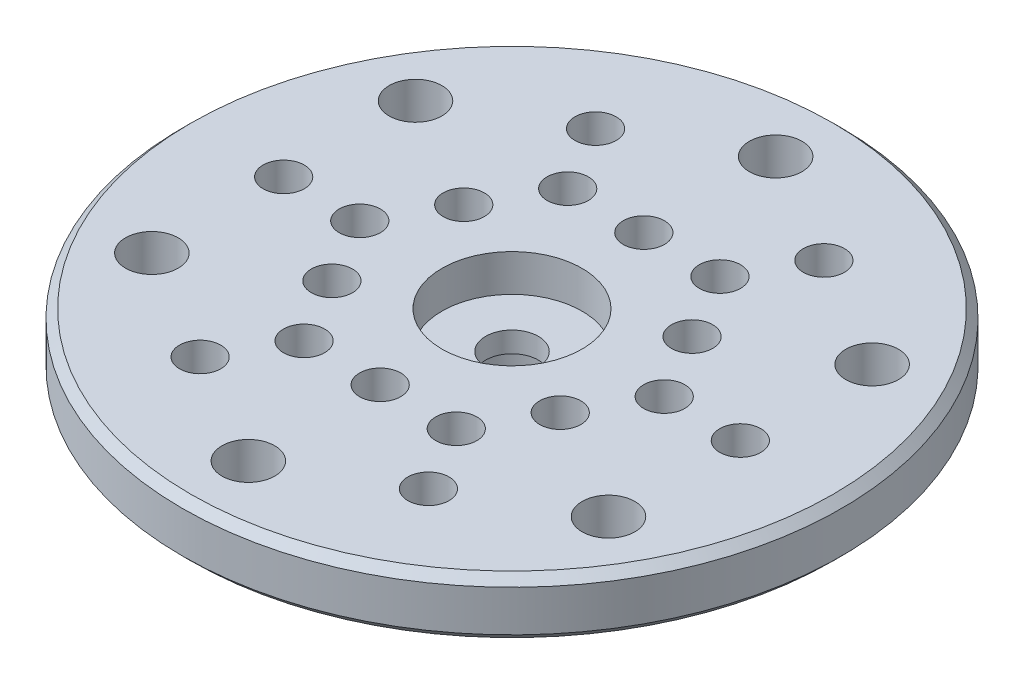
ISO-10303-21;
HEADER;
FILE_DESCRIPTION(('STEP AP214'),'2;1');
FILE_NAME('part.step','',(''),(''),'','','');
FILE_SCHEMA(('AUTOMOTIVE_DESIGN { 1 0 10303 214 1 1 1 1 }'));
ENDSEC;
DATA;
#1=APPLICATION_CONTEXT('core data for automotive mechanical design processes');
#2=APPLICATION_PROTOCOL_DEFINITION('international standard','automotive_design',2000,#1);
#3=PRODUCT_CONTEXT('',#1,'mechanical');
#4=PRODUCT('Part','Part','',(#3));
#5=PRODUCT_RELATED_PRODUCT_CATEGORY('part','',(#4));
#6=PRODUCT_DEFINITION_FORMATION('','',#4);
#7=PRODUCT_DEFINITION_CONTEXT('part definition',#1,'design');
#8=PRODUCT_DEFINITION('design','',#6,#7);
#9=PRODUCT_DEFINITION_SHAPE('','',#8);
#10=(LENGTH_UNIT() NAMED_UNIT(*) SI_UNIT(.MILLI.,.METRE.));
#11=(NAMED_UNIT(*) PLANE_ANGLE_UNIT() SI_UNIT($,.RADIAN.));
#12=(NAMED_UNIT(*) SI_UNIT($,.STERADIAN.) SOLID_ANGLE_UNIT());
#13=UNCERTAINTY_MEASURE_WITH_UNIT(LENGTH_MEASURE(1.E-05),#10,'distance_accuracy_value','');
#14=(GEOMETRIC_REPRESENTATION_CONTEXT(3) GLOBAL_UNCERTAINTY_ASSIGNED_CONTEXT((#13)) GLOBAL_UNIT_ASSIGNED_CONTEXT((#10,
#11,#12)) REPRESENTATION_CONTEXT('',''));
#15=CARTESIAN_POINT('',(0.,0.,0.));
#16=DIRECTION('',(0.,0.,1.));
#17=DIRECTION('',(1.,0.,0.));
#18=AXIS2_PLACEMENT_3D('',#15,#16,#17);
#19=CARTESIAN_POINT('',(0.,1.25,0.));
#20=DIRECTION('',(0.,1.,0.));
#21=DIRECTION('',(1.,0.,0.));
#22=AXIS2_PLACEMENT_3D('',#19,#20,#21);
#23=PLANE('',#22);
#24=CARTESIAN_POINT('',(0.,1.25,0.));
#25=DIRECTION('',(0.,1.,0.));
#26=DIRECTION('',(0.,0.,1.));
#27=AXIS2_PLACEMENT_3D('',#24,#25,#26);
#28=CIRCLE('',#27,1.6);
#29=CARTESIAN_POINT('',(0.,1.25,1.6));
#30=VERTEX_POINT('',#29);
#31=EDGE_CURVE('E62',#30,#30,#28,.T.);
#32=ORIENTED_EDGE('',*,*,#31,.F.);
#33=EDGE_LOOP('',(#32));
#34=FACE_BOUND('',#33,.T.);
#35=CARTESIAN_POINT('',(0.,1.25,0.));
#36=DIRECTION('',(0.,1.,0.));
#37=DIRECTION('',(0.,0.,1.));
#38=AXIS2_PLACEMENT_3D('',#35,#36,#37);
#39=CIRCLE('',#38,4.25);
#40=CARTESIAN_POINT('',(0.,1.25,4.25));
#41=VERTEX_POINT('',#40);
#42=EDGE_CURVE('E17',#41,#41,#39,.T.);
#43=ORIENTED_EDGE('',*,*,#42,.T.);
#44=EDGE_LOOP('',(#43));
#45=FACE_BOUND('',#44,.T.);
#46=ADVANCED_FACE('F14',(#34,#45),#23,.T.);
#47=CARTESIAN_POINT('',(0.,0.,0.));
#48=DIRECTION('',(0.,1.,0.));
#49=DIRECTION('',(1.,0.,0.));
#50=AXIS2_PLACEMENT_3D('',#47,#48,#49);
#51=PLANE('',#50);
#52=CARTESIAN_POINT('',(0.,0.,0.));
#53=DIRECTION('',(0.,1.,0.));
#54=DIRECTION('',(0.,0.,1.));
#55=AXIS2_PLACEMENT_3D('',#52,#53,#54);
#56=CIRCLE('',#55,1.6);
#57=CARTESIAN_POINT('',(0.,0.,1.6));
#58=VERTEX_POINT('',#57);
#59=EDGE_CURVE('E61',#58,#58,#56,.T.);
#60=ORIENTED_EDGE('',*,*,#59,.T.);
#61=EDGE_LOOP('',(#60));
#62=FACE_BOUND('',#61,.T.);
#63=CARTESIAN_POINT('',(0.,0.,0.));
#64=DIRECTION('',(0.,-1.,0.));
#65=DIRECTION('',(0.,0.,-1.));
#66=AXIS2_PLACEMENT_3D('',#63,#64,#65);
#67=CIRCLE('',#66,3.);
#68=CARTESIAN_POINT('',(0.,0.,-3.));
#69=VERTEX_POINT('',#68);
#70=EDGE_CURVE('E9',#69,#69,#67,.T.);
#71=ORIENTED_EDGE('',*,*,#70,.T.);
#72=EDGE_LOOP('',(#71));
#73=FACE_BOUND('',#72,.T.);
#74=ADVANCED_FACE('F365',(#62,#73),#51,.F.);
#75=CARTESIAN_POINT('',(0.,-3.5,0.));
#76=DIRECTION('',(0.,-1.,0.));
#77=DIRECTION('',(0.,0.,-1.));
#78=AXIS2_PLACEMENT_3D('',#75,#76,#77);
#79=PLANE('',#78);
#80=CARTESIAN_POINT('',(0.,-3.5,0.));
#81=DIRECTION('',(0.,1.,0.));
#82=DIRECTION('',(0.,0.,-1.));
#83=AXIS2_PLACEMENT_3D('',#80,#81,#82);
#84=CIRCLE('',#83,3.5);
#85=CARTESIAN_POINT('',(0.,-3.5,-3.5));
#86=VERTEX_POINT('',#85);
#87=EDGE_CURVE('E60',#86,#86,#84,.T.);
#88=ORIENTED_EDGE('',*,*,#87,.T.);
#89=EDGE_LOOP('',(#88));
#90=FACE_BOUND('',#89,.T.);
#91=CARTESIAN_POINT('',(0.,-3.5,0.));
#92=DIRECTION('',(0.,-1.,0.));
#93=DIRECTION('',(0.,0.,-1.));
#94=AXIS2_PLACEMENT_3D('',#91,#92,#93);
#95=CIRCLE('',#94,4.);
#96=CARTESIAN_POINT('',(0.,-3.5,-4.));
#97=VERTEX_POINT('',#96);
#98=EDGE_CURVE('E51',#97,#97,#95,.T.);
#99=ORIENTED_EDGE('',*,*,#98,.T.);
#100=EDGE_LOOP('',(#99));
#101=FACE_BOUND('',#100,.T.);
#102=ADVANCED_FACE('F369',(#90,#101),#79,.T.);
#103=CARTESIAN_POINT('',(0.,0.,0.));
#104=DIRECTION('',(0.,1.,0.));
#105=DIRECTION('',(1.,0.,0.));
#106=AXIS2_PLACEMENT_3D('',#103,#104,#105);
#107=PLANE('',#106);
#108=CARTESIAN_POINT('',(0.,0.,0.));
#109=DIRECTION('',(0.,1.,0.));
#110=DIRECTION('',(0.,0.,1.));
#111=AXIS2_PLACEMENT_3D('',#108,#109,#110);
#112=CIRCLE('',#111,5.);
#113=CARTESIAN_POINT('',(0.,0.,5.));
#114=VERTEX_POINT('',#113);
#115=EDGE_CURVE('E45',#114,#114,#112,.T.);
#116=ORIENTED_EDGE('',*,*,#115,.T.);
#117=EDGE_LOOP('',(#116));
#118=FACE_BOUND('',#117,.T.);
#119=CARTESIAN_POINT('',(-6.92820323027551,0.,-12.));
#120=DIRECTION('',(0.,1.,0.));
#121=DIRECTION('',(0.,0.,1.));
#122=AXIS2_PLACEMENT_3D('',#119,#120,#121);
#123=CIRCLE('',#122,1.25);
#124=CARTESIAN_POINT('',(-6.92820323027551,0.,-10.75));
#125=VERTEX_POINT('',#124);
#126=EDGE_CURVE('E34',#125,#125,#123,.T.);
#127=ORIENTED_EDGE('',*,*,#126,.T.);
#128=EDGE_LOOP('',(#127));
#129=FACE_BOUND('',#128,.T.);
#130=CARTESIAN_POINT('',(6.92820323027551,0.,-12.));
#131=DIRECTION('',(0.,1.,0.));
#132=DIRECTION('',(0.,0.,1.));
#133=AXIS2_PLACEMENT_3D('',#130,#131,#132);
#134=CIRCLE('',#133,1.25);
#135=CARTESIAN_POINT('',(6.92820323027551,0.,-10.75));
#136=VERTEX_POINT('',#135);
#137=EDGE_CURVE('E82',#136,#136,#134,.T.);
#138=ORIENTED_EDGE('',*,*,#137,.T.);
#139=EDGE_LOOP('',(#138));
#140=FACE_BOUND('',#139,.T.);
#141=CARTESIAN_POINT('',(13.856406460551,0.,1.30126035842245E-13));
#142=DIRECTION('',(0.,1.,0.));
#143=DIRECTION('',(0.,0.,1.));
#144=AXIS2_PLACEMENT_3D('',#141,#142,#143);
#145=CIRCLE('',#144,1.25);
#146=CARTESIAN_POINT('',(13.856406460551,0.,1.25000000000013));
#147=VERTEX_POINT('',#146);
#148=EDGE_CURVE('E94',#147,#147,#145,.T.);
#149=ORIENTED_EDGE('',*,*,#148,.T.);
#150=EDGE_LOOP('',(#149));
#151=FACE_BOUND('',#150,.T.);
#152=CARTESIAN_POINT('',(6.9282032302754,0.,12.));
#153=DIRECTION('',(0.,1.,0.));
#154=DIRECTION('',(0.,0.,1.));
#155=AXIS2_PLACEMENT_3D('',#152,#153,#154);
#156=CIRCLE('',#155,1.25);
#157=CARTESIAN_POINT('',(6.9282032302754,0.,13.25));
#158=VERTEX_POINT('',#157);
#159=EDGE_CURVE('E107',#158,#158,#156,.T.);
#160=ORIENTED_EDGE('',*,*,#159,.T.);
#161=EDGE_LOOP('',(#160));
#162=FACE_BOUND('',#161,.T.);
#163=CARTESIAN_POINT('',(-6.92820323027563,0.,12.));
#164=DIRECTION('',(0.,1.,0.));
#165=DIRECTION('',(0.,0.,1.));
#166=AXIS2_PLACEMENT_3D('',#163,#164,#165);
#167=CIRCLE('',#166,1.25);
#168=CARTESIAN_POINT('',(-6.92820323027563,0.,13.25));
#169=VERTEX_POINT('',#168);
#170=EDGE_CURVE('E119',#169,#169,#167,.T.);
#171=ORIENTED_EDGE('',*,*,#170,.T.);
#172=EDGE_LOOP('',(#171));
#173=FACE_BOUND('',#172,.T.);
#174=CARTESIAN_POINT('',(-13.856406460551,0.,-1.3010426069826E-13));
#175=DIRECTION('',(0.,1.,0.));
#176=DIRECTION('',(0.,0.,1.));
#177=AXIS2_PLACEMENT_3D('',#174,#175,#176);
#178=CIRCLE('',#177,1.25);
#179=CARTESIAN_POINT('',(-13.856406460551,0.,1.24999999999987));
#180=VERTEX_POINT('',#179);
#181=EDGE_CURVE('E142',#180,#180,#178,.T.);
#182=ORIENTED_EDGE('',*,*,#181,.T.);
#183=EDGE_LOOP('',(#182));
#184=FACE_BOUND('',#183,.T.);
#185=CARTESIAN_POINT('',(-6.92820323027556,0.,3.99999999999992));
#186=DIRECTION('',(0.,1.,0.));
#187=DIRECTION('',(0.,0.,1.));
#188=AXIS2_PLACEMENT_3D('',#185,#186,#187);
#189=CIRCLE('',#188,1.25);
#190=CARTESIAN_POINT('',(-6.92820323027556,0.,5.24999999999992));
#191=VERTEX_POINT('',#190);
#192=EDGE_CURVE('E125',#191,#191,#189,.T.);
#193=ORIENTED_EDGE('',*,*,#192,.T.);
#194=EDGE_LOOP('',(#193));
#195=FACE_BOUND('',#194,.T.);
#196=CARTESIAN_POINT('',(-9.23760430703402,0.,-1.07552855510562E-13));
#197=DIRECTION('',(0.,1.,0.));
#198=DIRECTION('',(0.,0.,1.));
#199=AXIS2_PLACEMENT_3D('',#196,#197,#198);
#200=CIRCLE('',#199,1.25);
#201=CARTESIAN_POINT('',(-9.23760430703402,0.,1.24999999999989));
#202=VERTEX_POINT('',#201);
#203=EDGE_CURVE('E135',#202,#202,#200,.T.);
#204=ORIENTED_EDGE('',*,*,#203,.T.);
#205=EDGE_LOOP('',(#204));
#206=FACE_BOUND('',#205,.T.);
#207=CARTESIAN_POINT('',(-6.92820323027547,0.,-4.00000000000008));
#208=DIRECTION('',(0.,1.,0.));
#209=DIRECTION('',(0.,0.,1.));
#210=AXIS2_PLACEMENT_3D('',#207,#208,#209);
#211=CIRCLE('',#210,1.25);
#212=CARTESIAN_POINT('',(-6.92820323027547,0.,-2.75000000000008));
#213=VERTEX_POINT('',#212);
#214=EDGE_CURVE('E132',#213,#213,#211,.T.);
#215=ORIENTED_EDGE('',*,*,#214,.T.);
#216=EDGE_LOOP('',(#215));
#217=FACE_BOUND('',#216,.T.);
#218=CARTESIAN_POINT('',(-4.61880215351701,0.,-8.));
#219=DIRECTION('',(0.,1.,0.));
#220=DIRECTION('',(0.,0.,1.));
#221=AXIS2_PLACEMENT_3D('',#218,#219,#220);
#222=CIRCLE('',#221,1.25);
#223=CARTESIAN_POINT('',(-4.61880215351701,0.,-6.75));
#224=VERTEX_POINT('',#223);
#225=EDGE_CURVE('E143',#224,#224,#222,.T.);
#226=ORIENTED_EDGE('',*,*,#225,.T.);
#227=EDGE_LOOP('',(#226));
#228=FACE_BOUND('',#227,.T.);
#229=CARTESIAN_POINT('',(0.,0.,-8.));
#230=DIRECTION('',(0.,1.,0.));
#231=DIRECTION('',(0.,0.,1.));
#232=AXIS2_PLACEMENT_3D('',#229,#230,#231);
#233=CIRCLE('',#232,1.25);
#234=CARTESIAN_POINT('',(0.,0.,-6.75));
#235=VERTEX_POINT('',#234);
#236=EDGE_CURVE('E161',#235,#235,#233,.T.);
#237=ORIENTED_EDGE('',*,*,#236,.T.);
#238=EDGE_LOOP('',(#237));
#239=FACE_BOUND('',#238,.T.);
#240=CARTESIAN_POINT('',(4.61880215351701,0.,-8.));
#241=DIRECTION('',(0.,1.,0.));
#242=DIRECTION('',(0.,0.,1.));
#243=AXIS2_PLACEMENT_3D('',#240,#241,#242);
#244=CIRCLE('',#243,1.25);
#245=CARTESIAN_POINT('',(4.61880215351701,0.,-6.75));
#246=VERTEX_POINT('',#245);
#247=EDGE_CURVE('E165',#246,#246,#244,.T.);
#248=ORIENTED_EDGE('',*,*,#247,.T.);
#249=EDGE_LOOP('',(#248));
#250=FACE_BOUND('',#249,.T.);
#251=CARTESIAN_POINT('',(6.92820323027552,0.,-4.));
#252=DIRECTION('',(0.,1.,0.));
#253=DIRECTION('',(0.,0.,1.));
#254=AXIS2_PLACEMENT_3D('',#251,#252,#253);
#255=CIRCLE('',#254,1.25);
#256=CARTESIAN_POINT('',(6.92820323027552,0.,-2.75));
#257=VERTEX_POINT('',#256);
#258=EDGE_CURVE('E170',#257,#257,#255,.T.);
#259=ORIENTED_EDGE('',*,*,#258,.T.);
#260=EDGE_LOOP('',(#259));
#261=FACE_BOUND('',#260,.T.);
#262=CARTESIAN_POINT('',(9.23760430703401,0.,1.07585230988181E-13));
#263=DIRECTION('',(0.,1.,0.));
#264=DIRECTION('',(0.,0.,1.));
#265=AXIS2_PLACEMENT_3D('',#262,#263,#264);
#266=CIRCLE('',#265,1.25);
#267=CARTESIAN_POINT('',(9.23760430703401,0.,1.25000000000011));
#268=VERTEX_POINT('',#267);
#269=EDGE_CURVE('E175',#268,#268,#266,.T.);
#270=ORIENTED_EDGE('',*,*,#269,.T.);
#271=EDGE_LOOP('',(#270));
#272=FACE_BOUND('',#271,.T.);
#273=CARTESIAN_POINT('',(6.9282032302755,0.,4.));
#274=DIRECTION('',(0.,1.,0.));
#275=DIRECTION('',(0.,0.,1.));
#276=AXIS2_PLACEMENT_3D('',#273,#274,#275);
#277=CIRCLE('',#276,1.25);
#278=CARTESIAN_POINT('',(6.9282032302755,0.,5.25));
#279=VERTEX_POINT('',#278);
#280=EDGE_CURVE('E188',#279,#279,#277,.T.);
#281=ORIENTED_EDGE('',*,*,#280,.T.);
#282=EDGE_LOOP('',(#281));
#283=FACE_BOUND('',#282,.T.);
#284=CARTESIAN_POINT('',(4.61880215351691,0.,8.));
#285=DIRECTION('',(0.,1.,0.));
#286=DIRECTION('',(0.,0.,1.));
#287=AXIS2_PLACEMENT_3D('',#284,#285,#286);
#288=CIRCLE('',#287,1.25);
#289=CARTESIAN_POINT('',(4.61880215351691,0.,9.25));
#290=VERTEX_POINT('',#289);
#291=EDGE_CURVE('E191',#290,#290,#288,.T.);
#292=ORIENTED_EDGE('',*,*,#291,.T.);
#293=EDGE_LOOP('',(#292));
#294=FACE_BOUND('',#293,.T.);
#295=CARTESIAN_POINT('',(0.,0.,8.));
#296=DIRECTION('',(0.,1.,0.));
#297=DIRECTION('',(0.,0.,1.));
#298=AXIS2_PLACEMENT_3D('',#295,#296,#297);
#299=CIRCLE('',#298,1.25);
#300=CARTESIAN_POINT('',(0.,0.,9.25));
#301=VERTEX_POINT('',#300);
#302=EDGE_CURVE('E205',#301,#301,#299,.T.);
#303=ORIENTED_EDGE('',*,*,#302,.T.);
#304=EDGE_LOOP('',(#303));
#305=FACE_BOUND('',#304,.T.);
#306=CARTESIAN_POINT('',(-4.61880215351711,0.,8.));
#307=DIRECTION('',(0.,1.,0.));
#308=DIRECTION('',(0.,0.,1.));
#309=AXIS2_PLACEMENT_3D('',#306,#307,#308);
#310=CIRCLE('',#309,1.25);
#311=CARTESIAN_POINT('',(-4.61880215351711,0.,9.25));
#312=VERTEX_POINT('',#311);
#313=EDGE_CURVE('E213',#312,#312,#310,.T.);
#314=ORIENTED_EDGE('',*,*,#313,.T.);
#315=EDGE_LOOP('',(#314));
#316=FACE_BOUND('',#315,.T.);
#317=CARTESIAN_POINT('',(13.856406460551,0.,8.));
#318=DIRECTION('',(0.,1.,0.));
#319=DIRECTION('',(0.,0.,1.));
#320=AXIS2_PLACEMENT_3D('',#317,#318,#319);
#321=CIRCLE('',#320,1.6);
#322=CARTESIAN_POINT('',(13.856406460551,0.,9.6));
#323=VERTEX_POINT('',#322);
#324=EDGE_CURVE('E217',#323,#323,#321,.T.);
#325=ORIENTED_EDGE('',*,*,#324,.T.);
#326=EDGE_LOOP('',(#325));
#327=FACE_BOUND('',#326,.T.);
#328=CARTESIAN_POINT('',(13.856406460551,0.,-8.));
#329=DIRECTION('',(0.,1.,0.));
#330=DIRECTION('',(0.,0.,1.));
#331=AXIS2_PLACEMENT_3D('',#328,#329,#330);
#332=CIRCLE('',#331,1.6);
#333=CARTESIAN_POINT('',(13.856406460551,0.,-6.4));
#334=VERTEX_POINT('',#333);
#335=EDGE_CURVE('E235',#334,#334,#332,.T.);
#336=ORIENTED_EDGE('',*,*,#335,.T.);
#337=EDGE_LOOP('',(#336));
#338=FACE_BOUND('',#337,.T.);
#339=CARTESIAN_POINT('',(-1.08257955891027E-13,0.,16.));
#340=DIRECTION('',(0.,1.,0.));
#341=DIRECTION('',(0.,0.,1.));
#342=AXIS2_PLACEMENT_3D('',#339,#340,#341);
#343=CIRCLE('',#342,1.6);
#344=CARTESIAN_POINT('',(-1.08257955891027E-13,0.,17.6));
#345=VERTEX_POINT('',#344);
#346=EDGE_CURVE('E242',#345,#345,#343,.T.);
#347=ORIENTED_EDGE('',*,*,#346,.T.);
#348=EDGE_LOOP('',(#347));
#349=FACE_BOUND('',#348,.T.);
#350=CARTESIAN_POINT('',(-13.8564064605511,0.,7.99999999999988));
#351=DIRECTION('',(0.,1.,0.));
#352=DIRECTION('',(0.,0.,1.));
#353=AXIS2_PLACEMENT_3D('',#350,#351,#352);
#354=CIRCLE('',#353,1.6);
#355=CARTESIAN_POINT('',(-13.8564064605511,0.,9.59999999999988));
#356=VERTEX_POINT('',#355);
#357=EDGE_CURVE('E253',#356,#356,#354,.T.);
#358=ORIENTED_EDGE('',*,*,#357,.T.);
#359=EDGE_LOOP('',(#358));
#360=FACE_BOUND('',#359,.T.);
#361=CARTESIAN_POINT('',(-13.8564064605509,0.,-8.00000000000017));
#362=DIRECTION('',(0.,1.,0.));
#363=DIRECTION('',(0.,0.,1.));
#364=AXIS2_PLACEMENT_3D('',#361,#362,#363);
#365=CIRCLE('',#364,1.6);
#366=CARTESIAN_POINT('',(-13.8564064605509,0.,-6.40000000000017));
#367=VERTEX_POINT('',#366);
#368=EDGE_CURVE('E267',#367,#367,#365,.T.);
#369=ORIENTED_EDGE('',*,*,#368,.T.);
#370=EDGE_LOOP('',(#369));
#371=FACE_BOUND('',#370,.T.);
#372=CARTESIAN_POINT('',(0.,0.,-16.));
#373=DIRECTION('',(0.,1.,0.));
#374=DIRECTION('',(0.,0.,1.));
#375=AXIS2_PLACEMENT_3D('',#372,#373,#374);
#376=CIRCLE('',#375,1.6);
#377=CARTESIAN_POINT('',(0.,0.,-14.4));
#378=VERTEX_POINT('',#377);
#379=EDGE_CURVE('E284',#378,#378,#376,.T.);
#380=ORIENTED_EDGE('',*,*,#379,.T.);
#381=EDGE_LOOP('',(#380));
#382=FACE_BOUND('',#381,.T.);
#383=CARTESIAN_POINT('',(0.,0.,0.));
#384=DIRECTION('',(0.,-1.,0.));
#385=DIRECTION('',(0.,0.,1.));
#386=AXIS2_PLACEMENT_3D('',#383,#384,#385);
#387=CIRCLE('',#386,19.5);
#388=CARTESIAN_POINT('',(0.,0.,19.5));
#389=VERTEX_POINT('',#388);
#390=EDGE_CURVE('E41',#389,#389,#387,.T.);
#391=ORIENTED_EDGE('',*,*,#390,.T.);
#392=EDGE_LOOP('',(#391));
#393=FACE_BOUND('',#392,.T.);
#394=ADVANCED_FACE('F304',(#118,#129,#140,#151,#162,#173,#184,#195,#206,#217,#228,#239,#250,
#261,#272,#283,#294,#305,#316,#327,#338,#349,#360,#371,#382,#393),#107,.F.);
#395=CARTESIAN_POINT('',(0.,3.5,0.));
#396=DIRECTION('',(0.,1.,0.));
#397=DIRECTION('',(1.,0.,0.));
#398=AXIS2_PLACEMENT_3D('',#395,#396,#397);
#399=PLANE('',#398);
#400=CARTESIAN_POINT('',(0.,3.5,0.));
#401=DIRECTION('',(0.,1.,0.));
#402=DIRECTION('',(0.,0.,1.));
#403=AXIS2_PLACEMENT_3D('',#400,#401,#402);
#404=CIRCLE('',#403,4.25);
#405=CARTESIAN_POINT('',(0.,3.5,4.25));
#406=VERTEX_POINT('',#405);
#407=EDGE_CURVE('E22',#406,#406,#404,.T.);
#408=ORIENTED_EDGE('',*,*,#407,.F.);
#409=EDGE_LOOP('',(#408));
#410=FACE_BOUND('',#409,.T.);
#411=CARTESIAN_POINT('',(-6.92820323027551,3.5,-12.));
#412=DIRECTION('',(0.,1.,0.));
#413=DIRECTION('',(0.,0.,1.));
#414=AXIS2_PLACEMENT_3D('',#411,#412,#413);
#415=CIRCLE('',#414,1.25);
#416=CARTESIAN_POINT('',(-6.92820323027551,3.5,-10.75));
#417=VERTEX_POINT('',#416);
#418=EDGE_CURVE('E254',#417,#417,#415,.T.);
#419=ORIENTED_EDGE('',*,*,#418,.F.);
#420=EDGE_LOOP('',(#419));
#421=FACE_BOUND('',#420,.T.);
#422=CARTESIAN_POINT('',(6.92820323027551,3.5,-12.));
#423=DIRECTION('',(0.,1.,0.));
#424=DIRECTION('',(0.,0.,1.));
#425=AXIS2_PLACEMENT_3D('',#422,#423,#424);
#426=CIRCLE('',#425,1.25);
#427=CARTESIAN_POINT('',(6.92820323027551,3.5,-10.75));
#428=VERTEX_POINT('',#427);
#429=EDGE_CURVE('E81',#428,#428,#426,.T.);
#430=ORIENTED_EDGE('',*,*,#429,.F.);
#431=EDGE_LOOP('',(#430));
#432=FACE_BOUND('',#431,.T.);
#433=CARTESIAN_POINT('',(13.856406460551,3.5,1.30126035842245E-13));
#434=DIRECTION('',(0.,1.,0.));
#435=DIRECTION('',(0.,0.,1.));
#436=AXIS2_PLACEMENT_3D('',#433,#434,#435);
#437=CIRCLE('',#436,1.25);
#438=CARTESIAN_POINT('',(13.856406460551,3.5,1.25000000000013));
#439=VERTEX_POINT('',#438);
#440=EDGE_CURVE('E78',#439,#439,#437,.T.);
#441=ORIENTED_EDGE('',*,*,#440,.F.);
#442=EDGE_LOOP('',(#441));
#443=FACE_BOUND('',#442,.T.);
#444=CARTESIAN_POINT('',(6.9282032302754,3.5,12.));
#445=DIRECTION('',(0.,1.,0.));
#446=DIRECTION('',(0.,0.,1.));
#447=AXIS2_PLACEMENT_3D('',#444,#445,#446);
#448=CIRCLE('',#447,1.25);
#449=CARTESIAN_POINT('',(6.9282032302754,3.5,13.25));
#450=VERTEX_POINT('',#449);
#451=EDGE_CURVE('E101',#450,#450,#448,.T.);
#452=ORIENTED_EDGE('',*,*,#451,.F.);
#453=EDGE_LOOP('',(#452));
#454=FACE_BOUND('',#453,.T.);
#455=CARTESIAN_POINT('',(-6.92820323027563,3.5,12.));
#456=DIRECTION('',(0.,1.,0.));
#457=DIRECTION('',(0.,0.,1.));
#458=AXIS2_PLACEMENT_3D('',#455,#456,#457);
#459=CIRCLE('',#458,1.25);
#460=CARTESIAN_POINT('',(-6.92820323027563,3.5,13.25));
#461=VERTEX_POINT('',#460);
#462=EDGE_CURVE('E111',#461,#461,#459,.T.);
#463=ORIENTED_EDGE('',*,*,#462,.F.);
#464=EDGE_LOOP('',(#463));
#465=FACE_BOUND('',#464,.T.);
#466=CARTESIAN_POINT('',(-13.856406460551,3.5,-1.3010426069826E-13));
#467=DIRECTION('',(0.,1.,0.));
#468=DIRECTION('',(0.,0.,1.));
#469=AXIS2_PLACEMENT_3D('',#466,#467,#468);
#470=CIRCLE('',#469,1.25);
#471=CARTESIAN_POINT('',(-13.856406460551,3.5,1.24999999999987));
#472=VERTEX_POINT('',#471);
#473=EDGE_CURVE('E148',#472,#472,#470,.T.);
#474=ORIENTED_EDGE('',*,*,#473,.F.);
#475=EDGE_LOOP('',(#474));
#476=FACE_BOUND('',#475,.T.);
#477=CARTESIAN_POINT('',(-6.92820323027556,3.5,3.99999999999992));
#478=DIRECTION('',(0.,1.,0.));
#479=DIRECTION('',(0.,0.,1.));
#480=AXIS2_PLACEMENT_3D('',#477,#478,#479);
#481=CIRCLE('',#480,1.25);
#482=CARTESIAN_POINT('',(-6.92820323027556,3.5,5.24999999999992));
#483=VERTEX_POINT('',#482);
#484=EDGE_CURVE('E130',#483,#483,#481,.T.);
#485=ORIENTED_EDGE('',*,*,#484,.F.);
#486=EDGE_LOOP('',(#485));
#487=FACE_BOUND('',#486,.T.);
#488=CARTESIAN_POINT('',(-9.23760430703402,3.5,-1.07552855510562E-13));
#489=DIRECTION('',(0.,1.,0.));
#490=DIRECTION('',(0.,0.,1.));
#491=AXIS2_PLACEMENT_3D('',#488,#489,#490);
#492=CIRCLE('',#491,1.25);
#493=CARTESIAN_POINT('',(-9.23760430703402,3.5,1.24999999999989));
#494=VERTEX_POINT('',#493);
#495=EDGE_CURVE('E126',#494,#494,#492,.T.);
#496=ORIENTED_EDGE('',*,*,#495,.F.);
#497=EDGE_LOOP('',(#496));
#498=FACE_BOUND('',#497,.T.);
#499=CARTESIAN_POINT('',(-6.92820323027547,3.5,-4.00000000000008));
#500=DIRECTION('',(0.,1.,0.));
#501=DIRECTION('',(0.,0.,1.));
#502=AXIS2_PLACEMENT_3D('',#499,#500,#501);
#503=CIRCLE('',#502,1.25);
#504=CARTESIAN_POINT('',(-6.92820323027547,3.5,-2.75000000000008));
#505=VERTEX_POINT('',#504);
#506=EDGE_CURVE('E128',#505,#505,#503,.T.);
#507=ORIENTED_EDGE('',*,*,#506,.F.);
#508=EDGE_LOOP('',(#507));
#509=FACE_BOUND('',#508,.T.);
#510=CARTESIAN_POINT('',(-4.61880215351701,3.5,-8.));
#511=DIRECTION('',(0.,1.,0.));
#512=DIRECTION('',(0.,0.,1.));
#513=AXIS2_PLACEMENT_3D('',#510,#511,#512);
#514=CIRCLE('',#513,1.25);
#515=CARTESIAN_POINT('',(-4.61880215351701,3.5,-6.75));
#516=VERTEX_POINT('',#515);
#517=EDGE_CURVE('E140',#516,#516,#514,.T.);
#518=ORIENTED_EDGE('',*,*,#517,.F.);
#519=EDGE_LOOP('',(#518));
#520=FACE_BOUND('',#519,.T.);
#521=CARTESIAN_POINT('',(0.,3.5,-8.));
#522=DIRECTION('',(0.,1.,0.));
#523=DIRECTION('',(0.,0.,1.));
#524=AXIS2_PLACEMENT_3D('',#521,#522,#523);
#525=CIRCLE('',#524,1.25);
#526=CARTESIAN_POINT('',(0.,3.5,-6.75));
#527=VERTEX_POINT('',#526);
#528=EDGE_CURVE('E147',#527,#527,#525,.T.);
#529=ORIENTED_EDGE('',*,*,#528,.F.);
#530=EDGE_LOOP('',(#529));
#531=FACE_BOUND('',#530,.T.);
#532=CARTESIAN_POINT('',(4.61880215351701,3.5,-8.));
#533=DIRECTION('',(0.,1.,0.));
#534=DIRECTION('',(0.,0.,1.));
#535=AXIS2_PLACEMENT_3D('',#532,#533,#534);
#536=CIRCLE('',#535,1.25);
#537=CARTESIAN_POINT('',(4.61880215351701,3.5,-6.75));
#538=VERTEX_POINT('',#537);
#539=EDGE_CURVE('E160',#538,#538,#536,.T.);
#540=ORIENTED_EDGE('',*,*,#539,.F.);
#541=EDGE_LOOP('',(#540));
#542=FACE_BOUND('',#541,.T.);
#543=CARTESIAN_POINT('',(6.92820323027552,3.5,-4.));
#544=DIRECTION('',(0.,1.,0.));
#545=DIRECTION('',(0.,0.,1.));
#546=AXIS2_PLACEMENT_3D('',#543,#544,#545);
#547=CIRCLE('',#546,1.25);
#548=CARTESIAN_POINT('',(6.92820323027552,3.5,-2.75));
#549=VERTEX_POINT('',#548);
#550=EDGE_CURVE('E167',#549,#549,#547,.T.);
#551=ORIENTED_EDGE('',*,*,#550,.F.);
#552=EDGE_LOOP('',(#551));
#553=FACE_BOUND('',#552,.T.);
#554=CARTESIAN_POINT('',(9.23760430703401,3.5,1.07585230988181E-13));
#555=DIRECTION('',(0.,1.,0.));
#556=DIRECTION('',(0.,0.,1.));
#557=AXIS2_PLACEMENT_3D('',#554,#555,#556);
#558=CIRCLE('',#557,1.25);
#559=CARTESIAN_POINT('',(9.23760430703401,3.5,1.25000000000011));
#560=VERTEX_POINT('',#559);
#561=EDGE_CURVE('E171',#560,#560,#558,.T.);
#562=ORIENTED_EDGE('',*,*,#561,.F.);
#563=EDGE_LOOP('',(#562));
#564=FACE_BOUND('',#563,.T.);
#565=CARTESIAN_POINT('',(6.9282032302755,3.5,4.));
#566=DIRECTION('',(0.,1.,0.));
#567=DIRECTION('',(0.,0.,1.));
#568=AXIS2_PLACEMENT_3D('',#565,#566,#567);
#569=CIRCLE('',#568,1.25);
#570=CARTESIAN_POINT('',(6.9282032302755,3.5,5.25));
#571=VERTEX_POINT('',#570);
#572=EDGE_CURVE('E184',#571,#571,#569,.T.);
#573=ORIENTED_EDGE('',*,*,#572,.F.);
#574=EDGE_LOOP('',(#573));
#575=FACE_BOUND('',#574,.T.);
#576=CARTESIAN_POINT('',(4.61880215351691,3.5,8.));
#577=DIRECTION('',(0.,1.,0.));
#578=DIRECTION('',(0.,0.,1.));
#579=AXIS2_PLACEMENT_3D('',#576,#577,#578);
#580=CIRCLE('',#579,1.25);
#581=CARTESIAN_POINT('',(4.61880215351691,3.5,9.25));
#582=VERTEX_POINT('',#581);
#583=EDGE_CURVE('E189',#582,#582,#580,.T.);
#584=ORIENTED_EDGE('',*,*,#583,.F.);
#585=EDGE_LOOP('',(#584));
#586=FACE_BOUND('',#585,.T.);
#587=CARTESIAN_POINT('',(0.,3.5,8.));
#588=DIRECTION('',(0.,1.,0.));
#589=DIRECTION('',(0.,0.,1.));
#590=AXIS2_PLACEMENT_3D('',#587,#588,#589);
#591=CIRCLE('',#590,1.25);
#592=CARTESIAN_POINT('',(0.,3.5,9.25));
#593=VERTEX_POINT('',#592);
#594=EDGE_CURVE('E197',#593,#593,#591,.T.);
#595=ORIENTED_EDGE('',*,*,#594,.F.);
#596=EDGE_LOOP('',(#595));
#597=FACE_BOUND('',#596,.T.);
#598=CARTESIAN_POINT('',(-4.61880215351711,3.5,8.));
#599=DIRECTION('',(0.,1.,0.));
#600=DIRECTION('',(0.,0.,1.));
#601=AXIS2_PLACEMENT_3D('',#598,#599,#600);
#602=CIRCLE('',#601,1.25);
#603=CARTESIAN_POINT('',(-4.61880215351711,3.5,9.25));
#604=VERTEX_POINT('',#603);
#605=EDGE_CURVE('E206',#604,#604,#602,.T.);
#606=ORIENTED_EDGE('',*,*,#605,.F.);
#607=EDGE_LOOP('',(#606));
#608=FACE_BOUND('',#607,.T.);
#609=CARTESIAN_POINT('',(13.856406460551,3.5,8.));
#610=DIRECTION('',(0.,1.,0.));
#611=DIRECTION('',(0.,0.,1.));
#612=AXIS2_PLACEMENT_3D('',#609,#610,#611);
#613=CIRCLE('',#612,1.6);
#614=CARTESIAN_POINT('',(13.856406460551,3.5,9.6));
#615=VERTEX_POINT('',#614);
#616=EDGE_CURVE('E212',#615,#615,#613,.T.);
#617=ORIENTED_EDGE('',*,*,#616,.F.);
#618=EDGE_LOOP('',(#617));
#619=FACE_BOUND('',#618,.T.);
#620=CARTESIAN_POINT('',(13.856406460551,3.5,-8.));
#621=DIRECTION('',(0.,1.,0.));
#622=DIRECTION('',(0.,0.,1.));
#623=AXIS2_PLACEMENT_3D('',#620,#621,#622);
#624=CIRCLE('',#623,1.6);
#625=CARTESIAN_POINT('',(13.856406460551,3.5,-6.4));
#626=VERTEX_POINT('',#625);
#627=EDGE_CURVE('E225',#626,#626,#624,.T.);
#628=ORIENTED_EDGE('',*,*,#627,.F.);
#629=EDGE_LOOP('',(#628));
#630=FACE_BOUND('',#629,.T.);
#631=CARTESIAN_POINT('',(-1.08257955891027E-13,3.5,16.));
#632=DIRECTION('',(0.,1.,0.));
#633=DIRECTION('',(0.,0.,1.));
#634=AXIS2_PLACEMENT_3D('',#631,#632,#633);
#635=CIRCLE('',#634,1.6);
#636=CARTESIAN_POINT('',(-1.08257955891027E-13,3.5,17.6));
#637=VERTEX_POINT('',#636);
#638=EDGE_CURVE('E237',#637,#637,#635,.T.);
#639=ORIENTED_EDGE('',*,*,#638,.F.);
#640=EDGE_LOOP('',(#639));
#641=FACE_BOUND('',#640,.T.);
#642=CARTESIAN_POINT('',(-13.8564064605511,3.5,7.99999999999988));
#643=DIRECTION('',(0.,1.,0.));
#644=DIRECTION('',(0.,0.,1.));
#645=AXIS2_PLACEMENT_3D('',#642,#643,#644);
#646=CIRCLE('',#645,1.6);
#647=CARTESIAN_POINT('',(-13.8564064605511,3.5,9.59999999999988));
#648=VERTEX_POINT('',#647);
#649=EDGE_CURVE('E250',#648,#648,#646,.T.);
#650=ORIENTED_EDGE('',*,*,#649,.F.);
#651=EDGE_LOOP('',(#650));
#652=FACE_BOUND('',#651,.T.);
#653=CARTESIAN_POINT('',(-13.8564064605509,3.5,-8.00000000000017));
#654=DIRECTION('',(0.,1.,0.));
#655=DIRECTION('',(0.,0.,1.));
#656=AXIS2_PLACEMENT_3D('',#653,#654,#655);
#657=CIRCLE('',#656,1.6);
#658=CARTESIAN_POINT('',(-13.8564064605509,3.5,-6.40000000000017));
#659=VERTEX_POINT('',#658);
#660=EDGE_CURVE('E259',#659,#659,#657,.T.);
#661=ORIENTED_EDGE('',*,*,#660,.F.);
#662=EDGE_LOOP('',(#661));
#663=FACE_BOUND('',#662,.T.);
#664=CARTESIAN_POINT('',(0.,3.5,-16.));
#665=DIRECTION('',(0.,1.,0.));
#666=DIRECTION('',(0.,0.,1.));
#667=AXIS2_PLACEMENT_3D('',#664,#665,#666);
#668=CIRCLE('',#667,1.6);
#669=CARTESIAN_POINT('',(0.,3.5,-14.4));
#670=VERTEX_POINT('',#669);
#671=EDGE_CURVE('E276',#670,#670,#668,.T.);
#672=ORIENTED_EDGE('',*,*,#671,.F.);
#673=EDGE_LOOP('',(#672));
#674=FACE_BOUND('',#673,.T.);
#675=CARTESIAN_POINT('',(0.,3.5,0.));
#676=DIRECTION('',(0.,1.,0.));
#677=DIRECTION('',(0.,0.,1.));
#678=AXIS2_PLACEMENT_3D('',#675,#676,#677);
#679=CIRCLE('',#678,19.5);
#680=CARTESIAN_POINT('',(0.,3.5,19.5));
#681=VERTEX_POINT('',#680);
#682=EDGE_CURVE('E55',#681,#681,#679,.T.);
#683=ORIENTED_EDGE('',*,*,#682,.T.);
#684=EDGE_LOOP('',(#683));
#685=FACE_BOUND('',#684,.T.);
#686=ADVANCED_FACE('F298',(#410,#421,#432,#443,#454,#465,#476,#487,#498,#509,#520,#531,#542,
#553,#564,#575,#586,#597,#608,#619,#630,#641,#652,#663,#674,#685),#399,.T.);
#687=CARTESIAN_POINT('',(0.,3.5,0.));
#688=DIRECTION('',(0.,-1.,0.));
#689=DIRECTION('',(0.,0.,-1.));
#690=AXIS2_PLACEMENT_3D('',#687,#688,#689);
#691=CYLINDRICAL_SURFACE('',#690,20.);
#692=CARTESIAN_POINT('',(0.,0.5,0.));
#693=DIRECTION('',(0.,1.,0.));
#694=DIRECTION('',(0.,0.,1.));
#695=AXIS2_PLACEMENT_3D('',#692,#693,#694);
#696=CIRCLE('',#695,20.);
#697=CARTESIAN_POINT('',(0.,0.5,20.));
#698=VERTEX_POINT('',#697);
#699=EDGE_CURVE('E46',#698,#698,#696,.T.);
#700=ORIENTED_EDGE('',*,*,#699,.T.);
#701=EDGE_LOOP('',(#700));
#702=FACE_BOUND('',#701,.T.);
#703=CARTESIAN_POINT('',(0.,3.,0.));
#704=DIRECTION('',(0.,-1.,0.));
#705=DIRECTION('',(0.,0.,1.));
#706=AXIS2_PLACEMENT_3D('',#703,#704,#705);
#707=CIRCLE('',#706,20.);
#708=CARTESIAN_POINT('',(0.,3.,20.));
#709=VERTEX_POINT('',#708);
#710=EDGE_CURVE('E50',#709,#709,#707,.T.);
#711=ORIENTED_EDGE('',*,*,#710,.T.);
#712=EDGE_LOOP('',(#711));
#713=FACE_BOUND('',#712,.T.);
#714=ADVANCED_FACE('F305',(#702,#713),#691,.T.);
#715=CARTESIAN_POINT('',(0.,-3.5,0.));
#716=DIRECTION('',(0.,1.,0.));
#717=DIRECTION('',(0.,0.,1.));
#718=AXIS2_PLACEMENT_3D('',#715,#716,#717);
#719=CYLINDRICAL_SURFACE('',#718,4.5);
#720=CARTESIAN_POINT('',(0.,-0.5,0.));
#721=DIRECTION('',(0.,-1.,0.));
#722=DIRECTION('',(0.,0.,1.));
#723=AXIS2_PLACEMENT_3D('',#720,#721,#722);
#724=CIRCLE('',#723,4.5);
#725=CARTESIAN_POINT('',(0.,-0.5,4.5));
#726=VERTEX_POINT('',#725);
#727=EDGE_CURVE('E40',#726,#726,#724,.T.);
#728=ORIENTED_EDGE('',*,*,#727,.T.);
#729=EDGE_LOOP('',(#728));
#730=FACE_BOUND('',#729,.T.);
#731=CARTESIAN_POINT('',(0.,-3.,0.));
#732=DIRECTION('',(0.,1.,0.));
#733=DIRECTION('',(0.,0.,-1.));
#734=AXIS2_PLACEMENT_3D('',#731,#732,#733);
#735=CIRCLE('',#734,4.5);
#736=CARTESIAN_POINT('',(0.,-3.,-4.5));
#737=VERTEX_POINT('',#736);
#738=EDGE_CURVE('E59',#737,#737,#735,.T.);
#739=ORIENTED_EDGE('',*,*,#738,.T.);
#740=EDGE_LOOP('',(#739));
#741=FACE_BOUND('',#740,.T.);
#742=ADVANCED_FACE('F383',(#730,#741),#719,.T.);
#743=CARTESIAN_POINT('',(0.,-3.5,0.));
#744=DIRECTION('',(0.,1.,0.));
#745=DIRECTION('',(0.,0.,1.));
#746=AXIS2_PLACEMENT_3D('',#743,#744,#745);
#747=CYLINDRICAL_SURFACE('',#746,3.);
#748=ORIENTED_EDGE('',*,*,#70,.F.);
#749=EDGE_LOOP('',(#748));
#750=FACE_BOUND('',#749,.T.);
#751=CARTESIAN_POINT('',(0.,-3.,0.));
#752=DIRECTION('',(0.,-1.,0.));
#753=DIRECTION('',(0.,0.,-1.));
#754=AXIS2_PLACEMENT_3D('',#751,#752,#753);
#755=CIRCLE('',#754,3.);
#756=CARTESIAN_POINT('',(0.,-3.,-3.));
#757=VERTEX_POINT('',#756);
#758=EDGE_CURVE('E52',#757,#757,#755,.T.);
#759=ORIENTED_EDGE('',*,*,#758,.T.);
#760=EDGE_LOOP('',(#759));
#761=FACE_BOUND('',#760,.T.);
#762=ADVANCED_FACE('F376',(#750,#761),#747,.F.);
#763=CARTESIAN_POINT('',(0.,1.25,0.));
#764=DIRECTION('',(0.,1.,0.));
#765=DIRECTION('',(0.,0.,1.));
#766=AXIS2_PLACEMENT_3D('',#763,#764,#765);
#767=CYLINDRICAL_SURFACE('',#766,4.25);
#768=ORIENTED_EDGE('',*,*,#407,.T.);
#769=EDGE_LOOP('',(#768));
#770=FACE_BOUND('',#769,.T.);
#771=ORIENTED_EDGE('',*,*,#42,.F.);
#772=EDGE_LOOP('',(#771));
#773=FACE_BOUND('',#772,.T.);
#774=ADVANCED_FACE('F373',(#770,#773),#767,.F.);
#775=CARTESIAN_POINT('',(0.,1.25,0.));
#776=DIRECTION('',(0.,1.,0.));
#777=DIRECTION('',(0.,0.,1.));
#778=AXIS2_PLACEMENT_3D('',#775,#776,#777);
#779=CYLINDRICAL_SURFACE('',#778,1.6);
#780=ORIENTED_EDGE('',*,*,#31,.T.);
#781=EDGE_LOOP('',(#780));
#782=FACE_BOUND('',#781,.T.);
#783=ORIENTED_EDGE('',*,*,#59,.F.);
#784=EDGE_LOOP('',(#783));
#785=FACE_BOUND('',#784,.T.);
#786=ADVANCED_FACE('F374',(#782,#785),#779,.F.);
#787=CARTESIAN_POINT('',(0.,-3.,0.));
#788=DIRECTION('',(0.,-1.,0.));
#789=DIRECTION('',(0.,0.,-1.));
#790=AXIS2_PLACEMENT_3D('',#787,#788,#789);
#791=CONICAL_SURFACE('',#790,3.,0.785398163397452);
#792=ORIENTED_EDGE('',*,*,#87,.F.);
#793=EDGE_LOOP('',(#792));
#794=FACE_BOUND('',#793,.T.);
#795=ORIENTED_EDGE('',*,*,#758,.F.);
#796=EDGE_LOOP('',(#795));
#797=FACE_BOUND('',#796,.T.);
#798=ADVANCED_FACE('F359',(#794,#797),#791,.F.);
#799=CARTESIAN_POINT('',(0.,-3.5,0.));
#800=DIRECTION('',(0.,1.,0.));
#801=DIRECTION('',(0.,0.,1.));
#802=AXIS2_PLACEMENT_3D('',#799,#800,#801);
#803=CONICAL_SURFACE('',#802,4.,0.785398163397446);
#804=ORIENTED_EDGE('',*,*,#738,.F.);
#805=EDGE_LOOP('',(#804));
#806=FACE_BOUND('',#805,.T.);
#807=ORIENTED_EDGE('',*,*,#98,.F.);
#808=EDGE_LOOP('',(#807));
#809=FACE_BOUND('',#808,.T.);
#810=ADVANCED_FACE('F346',(#806,#809),#803,.T.);
#811=CARTESIAN_POINT('',(0.,3.5,0.));
#812=DIRECTION('',(0.,-1.,0.));
#813=DIRECTION('',(0.,0.,-1.));
#814=AXIS2_PLACEMENT_3D('',#811,#812,#813);
#815=CONICAL_SURFACE('',#814,19.5,0.785398163397442);
#816=ORIENTED_EDGE('',*,*,#710,.F.);
#817=EDGE_LOOP('',(#816));
#818=FACE_BOUND('',#817,.T.);
#819=ORIENTED_EDGE('',*,*,#682,.F.);
#820=EDGE_LOOP('',(#819));
#821=FACE_BOUND('',#820,.T.);
#822=ADVANCED_FACE('F342',(#818,#821),#815,.T.);
#823=CARTESIAN_POINT('',(0.,0.5,0.));
#824=DIRECTION('',(0.,1.,0.));
#825=DIRECTION('',(0.,0.,1.));
#826=AXIS2_PLACEMENT_3D('',#823,#824,#825);
#827=CONICAL_SURFACE('',#826,20.,0.785398163397452);
#828=ORIENTED_EDGE('',*,*,#699,.F.);
#829=EDGE_LOOP('',(#828));
#830=FACE_BOUND('',#829,.T.);
#831=ORIENTED_EDGE('',*,*,#390,.F.);
#832=EDGE_LOOP('',(#831));
#833=FACE_BOUND('',#832,.T.);
#834=ADVANCED_FACE('F350',(#830,#833),#827,.T.);
#835=CARTESIAN_POINT('',(0.,-0.5,0.));
#836=DIRECTION('',(0.,1.,0.));
#837=DIRECTION('',(0.,0.,1.));
#838=AXIS2_PLACEMENT_3D('',#835,#836,#837);
#839=TOROIDAL_SURFACE('',#838,5.,0.5);
#840=ORIENTED_EDGE('',*,*,#727,.F.);
#841=EDGE_LOOP('',(#840));
#842=FACE_BOUND('',#841,.T.);
#843=ORIENTED_EDGE('',*,*,#115,.F.);
#844=EDGE_LOOP('',(#843));
#845=FACE_BOUND('',#844,.T.);
#846=ADVANCED_FACE('F354',(#842,#845),#839,.F.);
#847=CARTESIAN_POINT('',(-6.92820323027551,3.5,-12.));
#848=DIRECTION('',(0.,1.,0.));
#849=DIRECTION('',(0.,0.,1.));
#850=AXIS2_PLACEMENT_3D('',#847,#848,#849);
#851=CYLINDRICAL_SURFACE('',#850,1.25);
#852=ORIENTED_EDGE('',*,*,#418,.T.);
#853=EDGE_LOOP('',(#852));
#854=FACE_BOUND('',#853,.T.);
#855=ORIENTED_EDGE('',*,*,#126,.F.);
#856=EDGE_LOOP('',(#855));
#857=FACE_BOUND('',#856,.T.);
#858=ADVANCED_FACE('F441',(#854,#857),#851,.F.);
#859=CARTESIAN_POINT('',(6.92820323027551,3.5,-12.));
#860=DIRECTION('',(0.,1.,0.));
#861=DIRECTION('',(0.,0.,1.));
#862=AXIS2_PLACEMENT_3D('',#859,#860,#861);
#863=CYLINDRICAL_SURFACE('',#862,1.25);
#864=ORIENTED_EDGE('',*,*,#429,.T.);
#865=EDGE_LOOP('',(#864));
#866=FACE_BOUND('',#865,.T.);
#867=ORIENTED_EDGE('',*,*,#137,.F.);
#868=EDGE_LOOP('',(#867));
#869=FACE_BOUND('',#868,.T.);
#870=ADVANCED_FACE('F454',(#866,#869),#863,.F.);
#871=CARTESIAN_POINT('',(13.856406460551,3.5,1.30126035842245E-13));
#872=DIRECTION('',(0.,1.,0.));
#873=DIRECTION('',(0.,0.,1.));
#874=AXIS2_PLACEMENT_3D('',#871,#872,#873);
#875=CYLINDRICAL_SURFACE('',#874,1.25);
#876=ORIENTED_EDGE('',*,*,#440,.T.);
#877=EDGE_LOOP('',(#876));
#878=FACE_BOUND('',#877,.T.);
#879=ORIENTED_EDGE('',*,*,#148,.F.);
#880=EDGE_LOOP('',(#879));
#881=FACE_BOUND('',#880,.T.);
#882=ADVANCED_FACE('F467',(#878,#881),#875,.F.);
#883=CARTESIAN_POINT('',(6.9282032302754,3.5,12.));
#884=DIRECTION('',(0.,1.,0.));
#885=DIRECTION('',(0.,0.,1.));
#886=AXIS2_PLACEMENT_3D('',#883,#884,#885);
#887=CYLINDRICAL_SURFACE('',#886,1.25);
#888=ORIENTED_EDGE('',*,*,#451,.T.);
#889=EDGE_LOOP('',(#888));
#890=FACE_BOUND('',#889,.T.);
#891=ORIENTED_EDGE('',*,*,#159,.F.);
#892=EDGE_LOOP('',(#891));
#893=FACE_BOUND('',#892,.T.);
#894=ADVANCED_FACE('F480',(#890,#893),#887,.F.);
#895=CARTESIAN_POINT('',(-6.92820323027563,3.5,12.));
#896=DIRECTION('',(0.,1.,0.));
#897=DIRECTION('',(0.,0.,1.));
#898=AXIS2_PLACEMENT_3D('',#895,#896,#897);
#899=CYLINDRICAL_SURFACE('',#898,1.25);
#900=ORIENTED_EDGE('',*,*,#462,.T.);
#901=EDGE_LOOP('',(#900));
#902=FACE_BOUND('',#901,.T.);
#903=ORIENTED_EDGE('',*,*,#170,.F.);
#904=EDGE_LOOP('',(#903));
#905=FACE_BOUND('',#904,.T.);
#906=ADVANCED_FACE('F490',(#902,#905),#899,.F.);
#907=CARTESIAN_POINT('',(-13.856406460551,3.5,-1.3010426069826E-13));
#908=DIRECTION('',(0.,1.,0.));
#909=DIRECTION('',(0.,0.,1.));
#910=AXIS2_PLACEMENT_3D('',#907,#908,#909);
#911=CYLINDRICAL_SURFACE('',#910,1.25);
#912=ORIENTED_EDGE('',*,*,#473,.T.);
#913=EDGE_LOOP('',(#912));
#914=FACE_BOUND('',#913,.T.);
#915=ORIENTED_EDGE('',*,*,#181,.F.);
#916=EDGE_LOOP('',(#915));
#917=FACE_BOUND('',#916,.T.);
#918=ADVANCED_FACE('F296',(#914,#917),#911,.F.);
#919=CARTESIAN_POINT('',(-6.92820323027556,3.5,3.99999999999992));
#920=DIRECTION('',(0.,1.,0.));
#921=DIRECTION('',(0.,0.,1.));
#922=AXIS2_PLACEMENT_3D('',#919,#920,#921);
#923=CYLINDRICAL_SURFACE('',#922,1.25);
#924=ORIENTED_EDGE('',*,*,#484,.T.);
#925=EDGE_LOOP('',(#924));
#926=FACE_BOUND('',#925,.T.);
#927=ORIENTED_EDGE('',*,*,#192,.F.);
#928=EDGE_LOOP('',(#927));
#929=FACE_BOUND('',#928,.T.);
#930=ADVANCED_FACE('F508',(#926,#929),#923,.F.);
#931=CARTESIAN_POINT('',(-9.23760430703402,3.5,-1.07552855510562E-13));
#932=DIRECTION('',(0.,1.,0.));
#933=DIRECTION('',(0.,0.,1.));
#934=AXIS2_PLACEMENT_3D('',#931,#932,#933);
#935=CYLINDRICAL_SURFACE('',#934,1.25);
#936=ORIENTED_EDGE('',*,*,#495,.T.);
#937=EDGE_LOOP('',(#936));
#938=FACE_BOUND('',#937,.T.);
#939=ORIENTED_EDGE('',*,*,#203,.F.);
#940=EDGE_LOOP('',(#939));
#941=FACE_BOUND('',#940,.T.);
#942=ADVANCED_FACE('F517',(#938,#941),#935,.F.);
#943=CARTESIAN_POINT('',(-6.92820323027547,3.5,-4.00000000000008));
#944=DIRECTION('',(0.,1.,0.));
#945=DIRECTION('',(0.,0.,1.));
#946=AXIS2_PLACEMENT_3D('',#943,#944,#945);
#947=CYLINDRICAL_SURFACE('',#946,1.25);
#948=ORIENTED_EDGE('',*,*,#506,.T.);
#949=EDGE_LOOP('',(#948));
#950=FACE_BOUND('',#949,.T.);
#951=ORIENTED_EDGE('',*,*,#214,.F.);
#952=EDGE_LOOP('',(#951));
#953=FACE_BOUND('',#952,.T.);
#954=ADVANCED_FACE('F530',(#950,#953),#947,.F.);
#955=CARTESIAN_POINT('',(-4.61880215351701,3.5,-8.));
#956=DIRECTION('',(0.,1.,0.));
#957=DIRECTION('',(0.,0.,1.));
#958=AXIS2_PLACEMENT_3D('',#955,#956,#957);
#959=CYLINDRICAL_SURFACE('',#958,1.25);
#960=ORIENTED_EDGE('',*,*,#517,.T.);
#961=EDGE_LOOP('',(#960));
#962=FACE_BOUND('',#961,.T.);
#963=ORIENTED_EDGE('',*,*,#225,.F.);
#964=EDGE_LOOP('',(#963));
#965=FACE_BOUND('',#964,.T.);
#966=ADVANCED_FACE('F539',(#962,#965),#959,.F.);
#967=CARTESIAN_POINT('',(0.,3.5,-8.));
#968=DIRECTION('',(0.,1.,0.));
#969=DIRECTION('',(0.,0.,1.));
#970=AXIS2_PLACEMENT_3D('',#967,#968,#969);
#971=CYLINDRICAL_SURFACE('',#970,1.25);
#972=ORIENTED_EDGE('',*,*,#528,.T.);
#973=EDGE_LOOP('',(#972));
#974=FACE_BOUND('',#973,.T.);
#975=ORIENTED_EDGE('',*,*,#236,.F.);
#976=EDGE_LOOP('',(#975));
#977=FACE_BOUND('',#976,.T.);
#978=ADVANCED_FACE('F552',(#974,#977),#971,.F.);
#979=CARTESIAN_POINT('',(4.61880215351701,3.5,-8.));
#980=DIRECTION('',(0.,1.,0.));
#981=DIRECTION('',(0.,0.,1.));
#982=AXIS2_PLACEMENT_3D('',#979,#980,#981);
#983=CYLINDRICAL_SURFACE('',#982,1.25);
#984=ORIENTED_EDGE('',*,*,#539,.T.);
#985=EDGE_LOOP('',(#984));
#986=FACE_BOUND('',#985,.T.);
#987=ORIENTED_EDGE('',*,*,#247,.F.);
#988=EDGE_LOOP('',(#987));
#989=FACE_BOUND('',#988,.T.);
#990=ADVANCED_FACE('F565',(#986,#989),#983,.F.);
#991=CARTESIAN_POINT('',(6.92820323027552,3.5,-4.));
#992=DIRECTION('',(0.,1.,0.));
#993=DIRECTION('',(0.,0.,1.));
#994=AXIS2_PLACEMENT_3D('',#991,#992,#993);
#995=CYLINDRICAL_SURFACE('',#994,1.25);
#996=ORIENTED_EDGE('',*,*,#550,.T.);
#997=EDGE_LOOP('',(#996));
#998=FACE_BOUND('',#997,.T.);
#999=ORIENTED_EDGE('',*,*,#258,.F.);
#1000=EDGE_LOOP('',(#999));
#1001=FACE_BOUND('',#1000,.T.);
#1002=ADVANCED_FACE('F572',(#998,#1001),#995,.F.);
#1003=CARTESIAN_POINT('',(9.23760430703401,3.5,1.07585230988181E-13));
#1004=DIRECTION('',(0.,1.,0.));
#1005=DIRECTION('',(0.,0.,1.));
#1006=AXIS2_PLACEMENT_3D('',#1003,#1004,#1005);
#1007=CYLINDRICAL_SURFACE('',#1006,1.25);
#1008=ORIENTED_EDGE('',*,*,#561,.T.);
#1009=EDGE_LOOP('',(#1008));
#1010=FACE_BOUND('',#1009,.T.);
#1011=ORIENTED_EDGE('',*,*,#269,.F.);
#1012=EDGE_LOOP('',(#1011));
#1013=FACE_BOUND('',#1012,.T.);
#1014=ADVANCED_FACE('F585',(#1010,#1013),#1007,.F.);
#1015=CARTESIAN_POINT('',(6.9282032302755,3.5,4.));
#1016=DIRECTION('',(0.,1.,0.));
#1017=DIRECTION('',(0.,0.,1.));
#1018=AXIS2_PLACEMENT_3D('',#1015,#1016,#1017);
#1019=CYLINDRICAL_SURFACE('',#1018,1.25);
#1020=ORIENTED_EDGE('',*,*,#572,.T.);
#1021=EDGE_LOOP('',(#1020));
#1022=FACE_BOUND('',#1021,.T.);
#1023=ORIENTED_EDGE('',*,*,#280,.F.);
#1024=EDGE_LOOP('',(#1023));
#1025=FACE_BOUND('',#1024,.T.);
#1026=ADVANCED_FACE('F594',(#1022,#1025),#1019,.F.);
#1027=CARTESIAN_POINT('',(4.61880215351691,3.5,8.));
#1028=DIRECTION('',(0.,1.,0.));
#1029=DIRECTION('',(0.,0.,1.));
#1030=AXIS2_PLACEMENT_3D('',#1027,#1028,#1029);
#1031=CYLINDRICAL_SURFACE('',#1030,1.25);
#1032=ORIENTED_EDGE('',*,*,#583,.T.);
#1033=EDGE_LOOP('',(#1032));
#1034=FACE_BOUND('',#1033,.T.);
#1035=ORIENTED_EDGE('',*,*,#291,.F.);
#1036=EDGE_LOOP('',(#1035));
#1037=FACE_BOUND('',#1036,.T.);
#1038=ADVANCED_FACE('F607',(#1034,#1037),#1031,.F.);
#1039=CARTESIAN_POINT('',(0.,3.5,8.));
#1040=DIRECTION('',(0.,1.,0.));
#1041=DIRECTION('',(0.,0.,1.));
#1042=AXIS2_PLACEMENT_3D('',#1039,#1040,#1041);
#1043=CYLINDRICAL_SURFACE('',#1042,1.25);
#1044=ORIENTED_EDGE('',*,*,#594,.T.);
#1045=EDGE_LOOP('',(#1044));
#1046=FACE_BOUND('',#1045,.T.);
#1047=ORIENTED_EDGE('',*,*,#302,.F.);
#1048=EDGE_LOOP('',(#1047));
#1049=FACE_BOUND('',#1048,.T.);
#1050=ADVANCED_FACE('F620',(#1046,#1049),#1043,.F.);
#1051=CARTESIAN_POINT('',(-4.61880215351711,3.5,8.));
#1052=DIRECTION('',(0.,1.,0.));
#1053=DIRECTION('',(0.,0.,1.));
#1054=AXIS2_PLACEMENT_3D('',#1051,#1052,#1053);
#1055=CYLINDRICAL_SURFACE('',#1054,1.25);
#1056=ORIENTED_EDGE('',*,*,#605,.T.);
#1057=EDGE_LOOP('',(#1056));
#1058=FACE_BOUND('',#1057,.T.);
#1059=ORIENTED_EDGE('',*,*,#313,.F.);
#1060=EDGE_LOOP('',(#1059));
#1061=FACE_BOUND('',#1060,.T.);
#1062=ADVANCED_FACE('F627',(#1058,#1061),#1055,.F.);
#1063=CARTESIAN_POINT('',(13.856406460551,3.5,8.));
#1064=DIRECTION('',(0.,1.,0.));
#1065=DIRECTION('',(0.,0.,1.));
#1066=AXIS2_PLACEMENT_3D('',#1063,#1064,#1065);
#1067=CYLINDRICAL_SURFACE('',#1066,1.6);
#1068=ORIENTED_EDGE('',*,*,#616,.T.);
#1069=EDGE_LOOP('',(#1068));
#1070=FACE_BOUND('',#1069,.T.);
#1071=ORIENTED_EDGE('',*,*,#324,.F.);
#1072=EDGE_LOOP('',(#1071));
#1073=FACE_BOUND('',#1072,.T.);
#1074=ADVANCED_FACE('F640',(#1070,#1073),#1067,.F.);
#1075=CARTESIAN_POINT('',(13.856406460551,3.5,-8.));
#1076=DIRECTION('',(0.,1.,0.));
#1077=DIRECTION('',(0.,0.,1.));
#1078=AXIS2_PLACEMENT_3D('',#1075,#1076,#1077);
#1079=CYLINDRICAL_SURFACE('',#1078,1.6);
#1080=ORIENTED_EDGE('',*,*,#627,.T.);
#1081=EDGE_LOOP('',(#1080));
#1082=FACE_BOUND('',#1081,.T.);
#1083=ORIENTED_EDGE('',*,*,#335,.F.);
#1084=EDGE_LOOP('',(#1083));
#1085=FACE_BOUND('',#1084,.T.);
#1086=ADVANCED_FACE('F649',(#1082,#1085),#1079,.F.);
#1087=CARTESIAN_POINT('',(-1.08257955891027E-13,3.5,16.));
#1088=DIRECTION('',(0.,1.,0.));
#1089=DIRECTION('',(0.,0.,1.));
#1090=AXIS2_PLACEMENT_3D('',#1087,#1088,#1089);
#1091=CYLINDRICAL_SURFACE('',#1090,1.6);
#1092=ORIENTED_EDGE('',*,*,#638,.T.);
#1093=EDGE_LOOP('',(#1092));
#1094=FACE_BOUND('',#1093,.T.);
#1095=ORIENTED_EDGE('',*,*,#346,.F.);
#1096=EDGE_LOOP('',(#1095));
#1097=FACE_BOUND('',#1096,.T.);
#1098=ADVANCED_FACE('F662',(#1094,#1097),#1091,.F.);
#1099=CARTESIAN_POINT('',(-13.8564064605511,3.5,7.99999999999988));
#1100=DIRECTION('',(0.,1.,0.));
#1101=DIRECTION('',(0.,0.,1.));
#1102=AXIS2_PLACEMENT_3D('',#1099,#1100,#1101);
#1103=CYLINDRICAL_SURFACE('',#1102,1.6);
#1104=ORIENTED_EDGE('',*,*,#649,.T.);
#1105=EDGE_LOOP('',(#1104));
#1106=FACE_BOUND('',#1105,.T.);
#1107=ORIENTED_EDGE('',*,*,#357,.F.);
#1108=EDGE_LOOP('',(#1107));
#1109=FACE_BOUND('',#1108,.T.);
#1110=ADVANCED_FACE('F675',(#1106,#1109),#1103,.F.);
#1111=CARTESIAN_POINT('',(-13.8564064605509,3.5,-8.00000000000017));
#1112=DIRECTION('',(0.,1.,0.));
#1113=DIRECTION('',(0.,0.,1.));
#1114=AXIS2_PLACEMENT_3D('',#1111,#1112,#1113);
#1115=CYLINDRICAL_SURFACE('',#1114,1.6);
#1116=ORIENTED_EDGE('',*,*,#660,.T.);
#1117=EDGE_LOOP('',(#1116));
#1118=FACE_BOUND('',#1117,.T.);
#1119=ORIENTED_EDGE('',*,*,#368,.F.);
#1120=EDGE_LOOP('',(#1119));
#1121=FACE_BOUND('',#1120,.T.);
#1122=ADVANCED_FACE('F682',(#1118,#1121),#1115,.F.);
#1123=CARTESIAN_POINT('',(0.,3.5,-16.));
#1124=DIRECTION('',(0.,1.,0.));
#1125=DIRECTION('',(0.,0.,1.));
#1126=AXIS2_PLACEMENT_3D('',#1123,#1124,#1125);
#1127=CYLINDRICAL_SURFACE('',#1126,1.6);
#1128=ORIENTED_EDGE('',*,*,#671,.T.);
#1129=EDGE_LOOP('',(#1128));
#1130=FACE_BOUND('',#1129,.T.);
#1131=ORIENTED_EDGE('',*,*,#379,.F.);
#1132=EDGE_LOOP('',(#1131));
#1133=FACE_BOUND('',#1132,.T.);
#1134=ADVANCED_FACE('F695',(#1130,#1133),#1127,.F.);
#1135=CLOSED_SHELL('',(#46,#74,#102,#394,#686,#714,#742,#762,#774,#786,#798,#810,#822,#834,#846,
#858,#870,#882,#894,#906,#918,#930,#942,#954,#966,#978,#990,#1002,#1014,#1026,#1038,#1050,#1062,
#1074,#1086,#1098,#1110,#1122,#1134));
#1136=MANIFOLD_SOLID_BREP('B1',#1135);
#1137=ADVANCED_BREP_SHAPE_REPRESENTATION('',(#18,#1136),#14);
#1138=SHAPE_DEFINITION_REPRESENTATION(#9,#1137);
ENDSEC;
END-ISO-10303-21;
